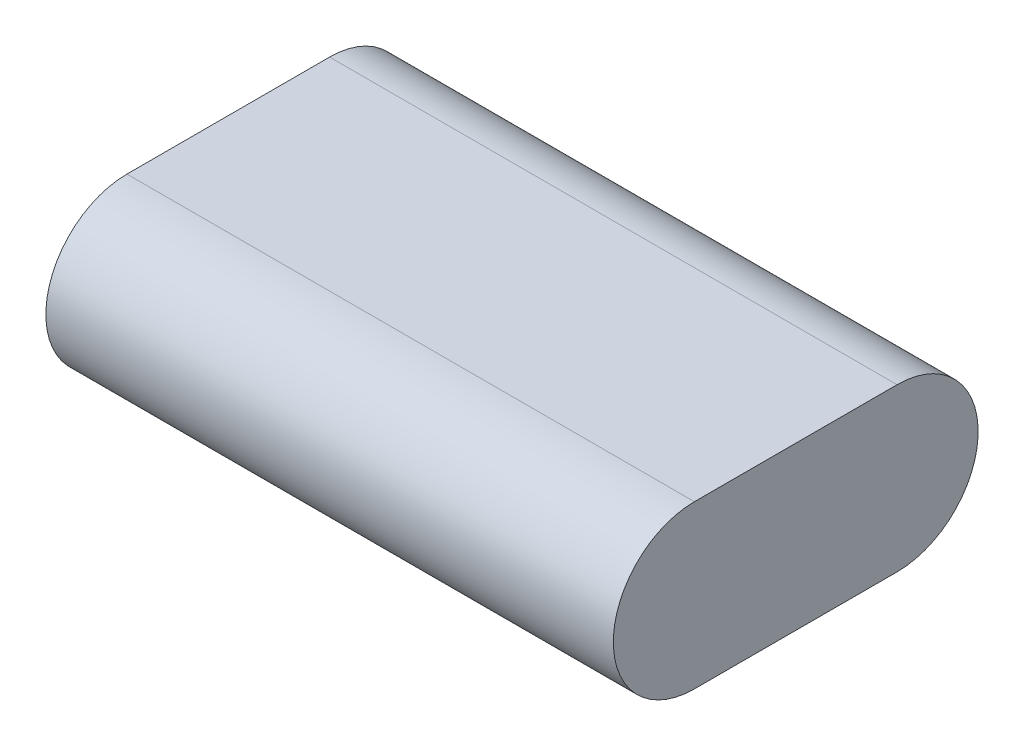
ISO-10303-21;
HEADER;
FILE_DESCRIPTION(('STEP AP214'),'2;1');
FILE_NAME('part.step','',(''),(''),'','','');
FILE_SCHEMA(('AUTOMOTIVE_DESIGN { 1 0 10303 214 1 1 1 1 }'));
ENDSEC;
DATA;
#1=APPLICATION_CONTEXT('core data for automotive mechanical design processes');
#2=APPLICATION_PROTOCOL_DEFINITION('international standard','automotive_design',2000,#1);
#3=PRODUCT_CONTEXT('',#1,'mechanical');
#4=PRODUCT('Part','Part','',(#3));
#5=PRODUCT_RELATED_PRODUCT_CATEGORY('part','',(#4));
#6=PRODUCT_DEFINITION_FORMATION('','',#4);
#7=PRODUCT_DEFINITION_CONTEXT('part definition',#1,'design');
#8=PRODUCT_DEFINITION('design','',#6,#7);
#9=PRODUCT_DEFINITION_SHAPE('','',#8);
#10=(LENGTH_UNIT() NAMED_UNIT(*) SI_UNIT(.MILLI.,.METRE.));
#11=(NAMED_UNIT(*) PLANE_ANGLE_UNIT() SI_UNIT($,.RADIAN.));
#12=(NAMED_UNIT(*) SI_UNIT($,.STERADIAN.) SOLID_ANGLE_UNIT());
#13=UNCERTAINTY_MEASURE_WITH_UNIT(LENGTH_MEASURE(1.E-05),#10,'distance_accuracy_value','');
#14=(GEOMETRIC_REPRESENTATION_CONTEXT(3) GLOBAL_UNCERTAINTY_ASSIGNED_CONTEXT((#13)) GLOBAL_UNIT_ASSIGNED_CONTEXT((#10,
#11,#12)) REPRESENTATION_CONTEXT('',''));
#15=CARTESIAN_POINT('',(0.,0.,0.));
#16=DIRECTION('',(0.,0.,1.));
#17=DIRECTION('',(1.,0.,0.));
#18=AXIS2_PLACEMENT_3D('',#15,#16,#17);
#19=CARTESIAN_POINT('',(14.,2.,0.));
#20=DIRECTION('',(-1.,0.,0.));
#21=DIRECTION('',(0.,0.,1.));
#22=AXIS2_PLACEMENT_3D('',#19,#20,#21);
#23=CYLINDRICAL_SURFACE('',#22,2.);
#24=CARTESIAN_POINT('',(0.,2.,0.));
#25=DIRECTION('',(1.,0.,0.));
#26=DIRECTION('',(0.,0.,-1.));
#27=AXIS2_PLACEMENT_3D('',#24,#25,#26);
#28=CIRCLE('',#27,2.);
#29=CARTESIAN_POINT('',(0.,4.,0.));
#30=VERTEX_POINT('',#29);
#31=CARTESIAN_POINT('',(0.,0.,0.));
#32=VERTEX_POINT('',#31);
#33=EDGE_CURVE('E96',#30,#32,#28,.T.);
#34=ORIENTED_EDGE('',*,*,#33,.T.);
#35=DIRECTION('',(-1.,0.,0.));
#36=VECTOR('',#35,1.);
#37=CARTESIAN_POINT('',(14.,0.,0.));
#38=LINE('',#37,#36);
#39=CARTESIAN_POINT('',(14.,0.,0.));
#40=VERTEX_POINT('',#39);
#41=EDGE_CURVE('E11',#40,#32,#38,.T.);
#42=ORIENTED_EDGE('',*,*,#41,.F.);
#43=CARTESIAN_POINT('',(14.,2.,0.));
#44=DIRECTION('',(1.,0.,0.));
#45=DIRECTION('',(0.,0.,-1.));
#46=AXIS2_PLACEMENT_3D('',#43,#44,#45);
#47=CIRCLE('',#46,2.);
#48=CARTESIAN_POINT('',(14.,4.,0.));
#49=VERTEX_POINT('',#48);
#50=EDGE_CURVE('E84',#49,#40,#47,.T.);
#51=ORIENTED_EDGE('',*,*,#50,.F.);
#52=DIRECTION('',(-1.,0.,0.));
#53=VECTOR('',#52,1.);
#54=CARTESIAN_POINT('',(14.,4.,0.));
#55=LINE('',#54,#53);
#56=EDGE_CURVE('E92',#49,#30,#55,.T.);
#57=ORIENTED_EDGE('',*,*,#56,.T.);
#58=EDGE_LOOP('',(#34,#42,#51,#57));
#59=FACE_BOUND('',#58,.T.);
#60=ADVANCED_FACE('F33',(#59),#23,.T.);
#61=CARTESIAN_POINT('',(14.,0.,0.));
#62=DIRECTION('',(0.,1.,0.));
#63=DIRECTION('',(0.,0.,1.));
#64=AXIS2_PLACEMENT_3D('',#61,#62,#63);
#65=PLANE('',#64);
#66=DIRECTION('',(0.,0.,-1.));
#67=VECTOR('',#66,1.);
#68=CARTESIAN_POINT('',(0.,0.,0.));
#69=LINE('',#68,#67);
#70=CARTESIAN_POINT('',(0.,0.,-5.));
#71=VERTEX_POINT('',#70);
#72=EDGE_CURVE('E88',#32,#71,#69,.T.);
#73=ORIENTED_EDGE('',*,*,#72,.T.);
#74=DIRECTION('',(-1.,0.,0.));
#75=VECTOR('',#74,1.);
#76=CARTESIAN_POINT('',(14.,0.,-5.));
#77=LINE('',#76,#75);
#78=CARTESIAN_POINT('',(14.,0.,-5.));
#79=VERTEX_POINT('',#78);
#80=EDGE_CURVE('E41',#79,#71,#77,.T.);
#81=ORIENTED_EDGE('',*,*,#80,.F.);
#82=DIRECTION('',(0.,0.,-1.));
#83=VECTOR('',#82,1.);
#84=CARTESIAN_POINT('',(14.,0.,0.));
#85=LINE('',#84,#83);
#86=EDGE_CURVE('E79',#40,#79,#85,.T.);
#87=ORIENTED_EDGE('',*,*,#86,.F.);
#88=ORIENTED_EDGE('',*,*,#41,.T.);
#89=EDGE_LOOP('',(#73,#81,#87,#88));
#90=FACE_BOUND('',#89,.T.);
#91=ADVANCED_FACE('F87',(#90),#65,.F.);
#92=CARTESIAN_POINT('',(14.,2.,-5.));
#93=DIRECTION('',(-1.,0.,0.));
#94=DIRECTION('',(0.,0.,1.));
#95=AXIS2_PLACEMENT_3D('',#92,#93,#94);
#96=CYLINDRICAL_SURFACE('',#95,2.);
#97=CARTESIAN_POINT('',(0.,2.,-5.));
#98=DIRECTION('',(1.,0.,0.));
#99=DIRECTION('',(0.,0.,-1.));
#100=AXIS2_PLACEMENT_3D('',#97,#98,#99);
#101=CIRCLE('',#100,2.);
#102=CARTESIAN_POINT('',(0.,4.,-5.));
#103=VERTEX_POINT('',#102);
#104=EDGE_CURVE('E66',#71,#103,#101,.T.);
#105=ORIENTED_EDGE('',*,*,#104,.T.);
#106=DIRECTION('',(-1.,0.,0.));
#107=VECTOR('',#106,1.);
#108=CARTESIAN_POINT('',(14.,4.,-5.));
#109=LINE('',#108,#107);
#110=CARTESIAN_POINT('',(14.,4.,-5.));
#111=VERTEX_POINT('',#110);
#112=EDGE_CURVE('E89',#111,#103,#109,.T.);
#113=ORIENTED_EDGE('',*,*,#112,.F.);
#114=CARTESIAN_POINT('',(14.,2.,-5.));
#115=DIRECTION('',(1.,0.,0.));
#116=DIRECTION('',(0.,0.,-1.));
#117=AXIS2_PLACEMENT_3D('',#114,#115,#116);
#118=CIRCLE('',#117,2.);
#119=EDGE_CURVE('E82',#79,#111,#118,.T.);
#120=ORIENTED_EDGE('',*,*,#119,.F.);
#121=ORIENTED_EDGE('',*,*,#80,.T.);
#122=EDGE_LOOP('',(#105,#113,#120,#121));
#123=FACE_BOUND('',#122,.T.);
#124=ADVANCED_FACE('F90',(#123),#96,.T.);
#125=CARTESIAN_POINT('',(14.,4.,0.));
#126=DIRECTION('',(0.,-1.,0.));
#127=DIRECTION('',(0.,0.,-1.));
#128=AXIS2_PLACEMENT_3D('',#125,#126,#127);
#129=PLANE('',#128);
#130=DIRECTION('',(0.,0.,1.));
#131=VECTOR('',#130,1.);
#132=CARTESIAN_POINT('',(0.,4.,0.));
#133=LINE('',#132,#131);
#134=EDGE_CURVE('E72',#103,#30,#133,.T.);
#135=ORIENTED_EDGE('',*,*,#134,.T.);
#136=ORIENTED_EDGE('',*,*,#56,.F.);
#137=DIRECTION('',(0.,0.,1.));
#138=VECTOR('',#137,1.);
#139=CARTESIAN_POINT('',(14.,4.,0.));
#140=LINE('',#139,#138);
#141=EDGE_CURVE('E49',#111,#49,#140,.T.);
#142=ORIENTED_EDGE('',*,*,#141,.F.);
#143=ORIENTED_EDGE('',*,*,#112,.T.);
#144=EDGE_LOOP('',(#135,#136,#142,#143));
#145=FACE_BOUND('',#144,.T.);
#146=ADVANCED_FACE('F103',(#145),#129,.F.);
#147=CARTESIAN_POINT('',(14.,2.,0.));
#148=DIRECTION('',(1.,0.,0.));
#149=DIRECTION('',(0.,0.,-1.));
#150=AXIS2_PLACEMENT_3D('',#147,#148,#149);
#151=PLANE('',#150);
#152=ORIENTED_EDGE('',*,*,#50,.T.);
#153=ORIENTED_EDGE('',*,*,#86,.T.);
#154=ORIENTED_EDGE('',*,*,#119,.T.);
#155=ORIENTED_EDGE('',*,*,#141,.T.);
#156=EDGE_LOOP('',(#152,#153,#154,#155));
#157=FACE_BOUND('',#156,.T.);
#158=ADVANCED_FACE('F80',(#157),#151,.T.);
#159=CARTESIAN_POINT('',(0.,2.,0.));
#160=DIRECTION('',(1.,0.,0.));
#161=DIRECTION('',(0.,0.,-1.));
#162=AXIS2_PLACEMENT_3D('',#159,#160,#161);
#163=PLANE('',#162);
#164=ORIENTED_EDGE('',*,*,#33,.F.);
#165=ORIENTED_EDGE('',*,*,#134,.F.);
#166=ORIENTED_EDGE('',*,*,#104,.F.);
#167=ORIENTED_EDGE('',*,*,#72,.F.);
#168=EDGE_LOOP('',(#164,#165,#166,#167));
#169=FACE_BOUND('',#168,.T.);
#170=ADVANCED_FACE('F106',(#169),#163,.F.);
#171=CLOSED_SHELL('',(#60,#91,#124,#146,#158,#170));
#172=MANIFOLD_SOLID_BREP('B2',#171);
#173=ADVANCED_BREP_SHAPE_REPRESENTATION('',(#18,#172),#14);
#174=SHAPE_DEFINITION_REPRESENTATION(#9,#173);
ENDSEC;
END-ISO-10303-21;
